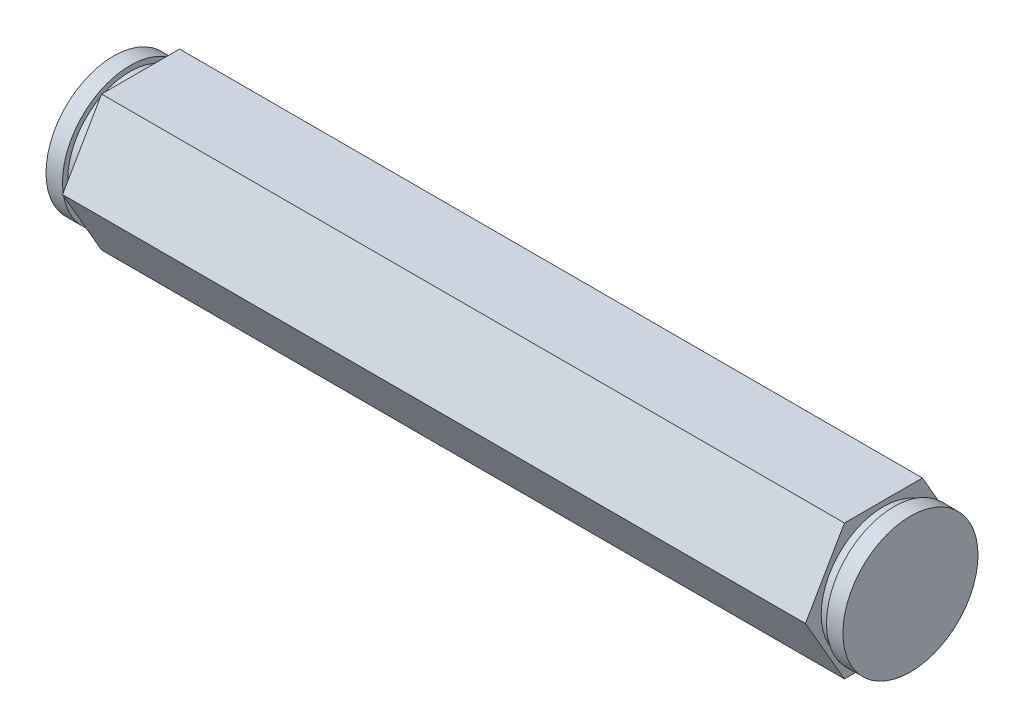
ISO-10303-21;
HEADER;
FILE_DESCRIPTION(('STEP AP214'),'2;1');
FILE_NAME('part.step','',(''),(''),'','','');
FILE_SCHEMA(('AUTOMOTIVE_DESIGN { 1 0 10303 214 1 1 1 1 }'));
ENDSEC;
DATA;
#1=APPLICATION_CONTEXT('core data for automotive mechanical design processes');
#2=APPLICATION_PROTOCOL_DEFINITION('international standard','automotive_design',2000,#1);
#3=PRODUCT_CONTEXT('',#1,'mechanical');
#4=PRODUCT('Part','Part','',(#3));
#5=PRODUCT_RELATED_PRODUCT_CATEGORY('part','',(#4));
#6=PRODUCT_DEFINITION_FORMATION('','',#4);
#7=PRODUCT_DEFINITION_CONTEXT('part definition',#1,'design');
#8=PRODUCT_DEFINITION('design','',#6,#7);
#9=PRODUCT_DEFINITION_SHAPE('','',#8);
#10=(LENGTH_UNIT() NAMED_UNIT(*) SI_UNIT(.MILLI.,.METRE.));
#11=(NAMED_UNIT(*) PLANE_ANGLE_UNIT() SI_UNIT($,.RADIAN.));
#12=(NAMED_UNIT(*) SI_UNIT($,.STERADIAN.) SOLID_ANGLE_UNIT());
#13=UNCERTAINTY_MEASURE_WITH_UNIT(LENGTH_MEASURE(1.E-05),#10,'distance_accuracy_value','');
#14=(GEOMETRIC_REPRESENTATION_CONTEXT(3) GLOBAL_UNCERTAINTY_ASSIGNED_CONTEXT((#13)) GLOBAL_UNIT_ASSIGNED_CONTEXT((#10,
#11,#12)) REPRESENTATION_CONTEXT('',''));
#15=CARTESIAN_POINT('',(0.,0.,0.));
#16=DIRECTION('',(0.,0.,1.));
#17=DIRECTION('',(1.,0.,0.));
#18=AXIS2_PLACEMENT_3D('',#15,#16,#17);
#19=CARTESIAN_POINT('',(37.465,-6.34999999999993,-3.66617420935418));
#20=DIRECTION('',(0.,0.499999999999995,0.866025403784441));
#21=DIRECTION('',(0.,-0.866025403784441,0.499999999999995));
#22=AXIS2_PLACEMENT_3D('',#19,#20,#21);
#23=PLANE('',#22);
#24=DIRECTION('',(-1.,0.,0.));
#25=VECTOR('',#24,1.);
#26=CARTESIAN_POINT('',(37.465,-6.34999999999993,-3.66617420935418));
#27=LINE('',#26,#25);
#28=CARTESIAN_POINT('',(34.925,-6.34999999999993,-3.66617420935418));
#29=VERTEX_POINT('',#28);
#30=CARTESIAN_POINT('',(-34.925,-6.34999999999993,-3.66617420935418));
#31=VERTEX_POINT('',#30);
#32=EDGE_CURVE('E105',#29,#31,#27,.T.);
#33=ORIENTED_EDGE('',*,*,#32,.T.);
#34=DIRECTION('',(0.,0.866025403784441,-0.499999999999995));
#35=VECTOR('',#34,1.);
#36=CARTESIAN_POINT('',(-34.925,-6.34999999999993,-3.66617420935418));
#37=LINE('',#36,#35);
#38=CARTESIAN_POINT('',(-34.925,0.,-7.33234841870821));
#39=VERTEX_POINT('',#38);
#40=EDGE_CURVE('E51',#31,#39,#37,.T.);
#41=ORIENTED_EDGE('',*,*,#40,.T.);
#42=DIRECTION('',(-1.,0.,0.));
#43=VECTOR('',#42,1.);
#44=CARTESIAN_POINT('',(37.465,0.,-7.33234841870821));
#45=LINE('',#44,#43);
#46=CARTESIAN_POINT('',(34.925,0.,-7.33234841870821));
#47=VERTEX_POINT('',#46);
#48=EDGE_CURVE('E118',#47,#39,#45,.T.);
#49=ORIENTED_EDGE('',*,*,#48,.F.);
#50=DIRECTION('',(0.,-0.866025403784441,0.499999999999995));
#51=VECTOR('',#50,1.);
#52=CARTESIAN_POINT('',(34.925,-6.34999999999993,-3.66617420935418));
#53=LINE('',#52,#51);
#54=EDGE_CURVE('E109',#47,#29,#53,.T.);
#55=ORIENTED_EDGE('',*,*,#54,.T.);
#56=EDGE_LOOP('',(#33,#41,#49,#55));
#57=FACE_BOUND('',#56,.T.);
#58=ADVANCED_FACE('F37',(#57),#23,.F.);
#59=CARTESIAN_POINT('',(37.465,0.,-7.33234841870821));
#60=DIRECTION('',(0.,-0.500000000000001,0.866025403784438));
#61=DIRECTION('',(0.,-0.866025403784438,-0.500000000000001));
#62=AXIS2_PLACEMENT_3D('',#59,#60,#61);
#63=PLANE('',#62);
#64=ORIENTED_EDGE('',*,*,#48,.T.);
#65=DIRECTION('',(0.,0.866025403784438,0.500000000000001));
#66=VECTOR('',#65,1.);
#67=CARTESIAN_POINT('',(-34.925,0.,-7.33234841870821));
#68=LINE('',#67,#66);
#69=CARTESIAN_POINT('',(-34.925,6.34999999999998,-3.66617420935409));
#70=VERTEX_POINT('',#69);
#71=EDGE_CURVE('E149',#39,#70,#68,.T.);
#72=ORIENTED_EDGE('',*,*,#71,.T.);
#73=DIRECTION('',(-1.,0.,0.));
#74=VECTOR('',#73,1.);
#75=CARTESIAN_POINT('',(37.465,6.34999999999998,-3.66617420935409));
#76=LINE('',#75,#74);
#77=CARTESIAN_POINT('',(34.925,6.34999999999998,-3.66617420935409));
#78=VERTEX_POINT('',#77);
#79=EDGE_CURVE('E115',#78,#70,#76,.T.);
#80=ORIENTED_EDGE('',*,*,#79,.F.);
#81=DIRECTION('',(0.,-0.866025403784438,-0.500000000000001));
#82=VECTOR('',#81,1.);
#83=CARTESIAN_POINT('',(34.925,0.,-7.33234841870821));
#84=LINE('',#83,#82);
#85=EDGE_CURVE('E169',#78,#47,#84,.T.);
#86=ORIENTED_EDGE('',*,*,#85,.T.);
#87=EDGE_LOOP('',(#64,#72,#80,#86));
#88=FACE_BOUND('',#87,.T.);
#89=ADVANCED_FACE('F177',(#88),#63,.F.);
#90=CARTESIAN_POINT('',(37.465,6.34999999999998,-3.66617420935409));
#91=DIRECTION('',(0.,-1.,0.));
#92=DIRECTION('',(0.,0.,-1.));
#93=AXIS2_PLACEMENT_3D('',#90,#91,#92);
#94=PLANE('',#93);
#95=ORIENTED_EDGE('',*,*,#79,.T.);
#96=DIRECTION('',(0.,0.,1.));
#97=VECTOR('',#96,1.);
#98=CARTESIAN_POINT('',(-34.925,6.34999999999998,-3.66617420935409));
#99=LINE('',#98,#97);
#100=CARTESIAN_POINT('',(-34.925,6.34999999999995,3.66617420935414));
#101=VERTEX_POINT('',#100);
#102=EDGE_CURVE('E146',#70,#101,#99,.T.);
#103=ORIENTED_EDGE('',*,*,#102,.T.);
#104=DIRECTION('',(-1.,0.,0.));
#105=VECTOR('',#104,1.);
#106=CARTESIAN_POINT('',(37.465,6.34999999999995,3.66617420935414));
#107=LINE('',#106,#105);
#108=CARTESIAN_POINT('',(34.925,6.34999999999995,3.66617420935414));
#109=VERTEX_POINT('',#108);
#110=EDGE_CURVE('E107',#109,#101,#107,.T.);
#111=ORIENTED_EDGE('',*,*,#110,.F.);
#112=DIRECTION('',(0.,0.,-1.));
#113=VECTOR('',#112,1.);
#114=CARTESIAN_POINT('',(34.925,6.34999999999998,-3.66617420935409));
#115=LINE('',#114,#113);
#116=EDGE_CURVE('E166',#109,#78,#115,.T.);
#117=ORIENTED_EDGE('',*,*,#116,.T.);
#118=EDGE_LOOP('',(#95,#103,#111,#117));
#119=FACE_BOUND('',#118,.T.);
#120=ADVANCED_FACE('F179',(#119),#94,.F.);
#121=CARTESIAN_POINT('',(37.465,6.34999999999995,3.66617420935414));
#122=DIRECTION('',(0.,-0.499999999999995,-0.866025403784442));
#123=DIRECTION('',(0.,0.866025403784442,-0.499999999999995));
#124=AXIS2_PLACEMENT_3D('',#121,#122,#123);
#125=PLANE('',#124);
#126=ORIENTED_EDGE('',*,*,#110,.T.);
#127=DIRECTION('',(0.,-0.866025403784442,0.499999999999995));
#128=VECTOR('',#127,1.);
#129=CARTESIAN_POINT('',(-34.925,6.34999999999995,3.66617420935414));
#130=LINE('',#129,#128);
#131=CARTESIAN_POINT('',(-34.925,0.,7.33234841870821));
#132=VERTEX_POINT('',#131);
#133=EDGE_CURVE('E100',#101,#132,#130,.T.);
#134=ORIENTED_EDGE('',*,*,#133,.T.);
#135=DIRECTION('',(-1.,0.,0.));
#136=VECTOR('',#135,1.);
#137=CARTESIAN_POINT('',(37.465,0.,7.33234841870821));
#138=LINE('',#137,#136);
#139=CARTESIAN_POINT('',(34.925,0.,7.33234841870821));
#140=VERTEX_POINT('',#139);
#141=EDGE_CURVE('E99',#140,#132,#138,.T.);
#142=ORIENTED_EDGE('',*,*,#141,.F.);
#143=DIRECTION('',(0.,0.866025403784442,-0.499999999999995));
#144=VECTOR('',#143,1.);
#145=CARTESIAN_POINT('',(34.925,6.34999999999995,3.66617420935414));
#146=LINE('',#145,#144);
#147=EDGE_CURVE('E163',#140,#109,#146,.T.);
#148=ORIENTED_EDGE('',*,*,#147,.T.);
#149=EDGE_LOOP('',(#126,#134,#142,#148));
#150=FACE_BOUND('',#149,.T.);
#151=ADVANCED_FACE('F182',(#150),#125,.F.);
#152=CARTESIAN_POINT('',(37.465,0.,7.33234841870821));
#153=DIRECTION('',(0.,0.500000000000007,-0.866025403784435));
#154=DIRECTION('',(0.,0.866025403784435,0.500000000000007));
#155=AXIS2_PLACEMENT_3D('',#152,#153,#154);
#156=PLANE('',#155);
#157=ORIENTED_EDGE('',*,*,#141,.T.);
#158=DIRECTION('',(0.,-0.866025403784435,-0.500000000000007));
#159=VECTOR('',#158,1.);
#160=CARTESIAN_POINT('',(-34.925,0.,7.33234841870821));
#161=LINE('',#160,#159);
#162=CARTESIAN_POINT('',(-34.925,-6.35,3.66617420935405));
#163=VERTEX_POINT('',#162);
#164=EDGE_CURVE('E87',#132,#163,#161,.T.);
#165=ORIENTED_EDGE('',*,*,#164,.T.);
#166=DIRECTION('',(-1.,0.,0.));
#167=VECTOR('',#166,1.);
#168=CARTESIAN_POINT('',(37.465,-6.35,3.66617420935405));
#169=LINE('',#168,#167);
#170=CARTESIAN_POINT('',(34.925,-6.35,3.66617420935405));
#171=VERTEX_POINT('',#170);
#172=EDGE_CURVE('E97',#171,#163,#169,.T.);
#173=ORIENTED_EDGE('',*,*,#172,.F.);
#174=DIRECTION('',(0.,0.866025403784435,0.500000000000007));
#175=VECTOR('',#174,1.);
#176=CARTESIAN_POINT('',(34.925,0.,7.33234841870821));
#177=LINE('',#176,#175);
#178=EDGE_CURVE('E58',#171,#140,#177,.T.);
#179=ORIENTED_EDGE('',*,*,#178,.T.);
#180=EDGE_LOOP('',(#157,#165,#173,#179));
#181=FACE_BOUND('',#180,.T.);
#182=ADVANCED_FACE('F96',(#181),#156,.F.);
#183=CARTESIAN_POINT('',(37.465,-6.35,3.66617420935405));
#184=DIRECTION('',(0.,1.,0.));
#185=DIRECTION('',(0.,0.,1.));
#186=AXIS2_PLACEMENT_3D('',#183,#184,#185);
#187=PLANE('',#186);
#188=ORIENTED_EDGE('',*,*,#172,.T.);
#189=DIRECTION('',(0.,0.,-1.));
#190=VECTOR('',#189,1.);
#191=CARTESIAN_POINT('',(-34.925,-6.35,3.66617420935405));
#192=LINE('',#191,#190);
#193=EDGE_CURVE('E11',#163,#31,#192,.T.);
#194=ORIENTED_EDGE('',*,*,#193,.T.);
#195=ORIENTED_EDGE('',*,*,#32,.F.);
#196=DIRECTION('',(0.,0.,1.));
#197=VECTOR('',#196,1.);
#198=CARTESIAN_POINT('',(34.925,-6.35,3.66617420935405));
#199=LINE('',#198,#197);
#200=EDGE_CURVE('E104',#29,#171,#199,.T.);
#201=ORIENTED_EDGE('',*,*,#200,.T.);
#202=EDGE_LOOP('',(#188,#194,#195,#201));
#203=FACE_BOUND('',#202,.T.);
#204=ADVANCED_FACE('F103',(#203),#187,.F.);
#205=CARTESIAN_POINT('',(34.925,0.,8.89));
#206=DIRECTION('',(-1.,0.,0.));
#207=DIRECTION('',(0.,0.,1.));
#208=AXIS2_PLACEMENT_3D('',#205,#206,#207);
#209=PLANE('',#208);
#210=CARTESIAN_POINT('',(34.925,0.,0.));
#211=DIRECTION('',(-1.,0.,0.));
#212=DIRECTION('',(0.,0.,1.));
#213=AXIS2_PLACEMENT_3D('',#210,#211,#212);
#214=CIRCLE('',#213,5.8547);
#215=CARTESIAN_POINT('',(34.925,0.,5.8547));
#216=VERTEX_POINT('',#215);
#217=EDGE_CURVE('E159',#216,#216,#214,.T.);
#218=ORIENTED_EDGE('',*,*,#217,.T.);
#219=EDGE_LOOP('',(#218));
#220=FACE_BOUND('',#219,.T.);
#221=ORIENTED_EDGE('',*,*,#85,.F.);
#222=ORIENTED_EDGE('',*,*,#116,.F.);
#223=ORIENTED_EDGE('',*,*,#147,.F.);
#224=ORIENTED_EDGE('',*,*,#178,.F.);
#225=ORIENTED_EDGE('',*,*,#200,.F.);
#226=ORIENTED_EDGE('',*,*,#54,.F.);
#227=EDGE_LOOP('',(#221,#222,#223,#224,#225,#226));
#228=FACE_BOUND('',#227,.T.);
#229=ADVANCED_FACE('F174',(#220,#228),#209,.F.);
#230=CARTESIAN_POINT('',(0.,0.,0.));
#231=DIRECTION('',(-1.,0.,0.));
#232=DIRECTION('',(0.,0.,1.));
#233=AXIS2_PLACEMENT_3D('',#230,#231,#232);
#234=CYLINDRICAL_SURFACE('',#233,6.35);
#235=CARTESIAN_POINT('',(37.465,0.,0.));
#236=DIRECTION('',(1.,0.,0.));
#237=DIRECTION('',(0.,0.,-1.));
#238=AXIS2_PLACEMENT_3D('',#235,#236,#237);
#239=CIRCLE('',#238,6.35);
#240=CARTESIAN_POINT('',(37.465,0.,-6.35));
#241=VERTEX_POINT('',#240);
#242=EDGE_CURVE('E121',#241,#241,#239,.F.);
#243=ORIENTED_EDGE('',*,*,#242,.T.);
#244=EDGE_LOOP('',(#243));
#245=FACE_BOUND('',#244,.T.);
#246=CARTESIAN_POINT('',(35.9156,0.,0.));
#247=DIRECTION('',(-1.,0.,0.));
#248=DIRECTION('',(0.,0.,1.));
#249=AXIS2_PLACEMENT_3D('',#246,#247,#248);
#250=CIRCLE('',#249,6.35);
#251=CARTESIAN_POINT('',(35.9156,0.,6.35));
#252=VERTEX_POINT('',#251);
#253=EDGE_CURVE('E153',#252,#252,#250,.T.);
#254=ORIENTED_EDGE('',*,*,#253,.F.);
#255=EDGE_LOOP('',(#254));
#256=FACE_BOUND('',#255,.T.);
#257=ADVANCED_FACE('F299',(#245,#256),#234,.T.);
#258=CARTESIAN_POINT('',(0.,0.,0.));
#259=DIRECTION('',(-1.,0.,0.));
#260=DIRECTION('',(0.,0.,1.));
#261=AXIS2_PLACEMENT_3D('',#258,#259,#260);
#262=CYLINDRICAL_SURFACE('',#261,5.8547);
#263=ORIENTED_EDGE('',*,*,#217,.F.);
#264=EDGE_LOOP('',(#263));
#265=FACE_BOUND('',#264,.T.);
#266=CARTESIAN_POINT('',(35.9156,0.,0.));
#267=DIRECTION('',(-1.,0.,0.));
#268=DIRECTION('',(0.,0.,1.));
#269=AXIS2_PLACEMENT_3D('',#266,#267,#268);
#270=CIRCLE('',#269,5.8547);
#271=CARTESIAN_POINT('',(35.9156,0.,5.8547));
#272=VERTEX_POINT('',#271);
#273=EDGE_CURVE('E156',#272,#272,#270,.T.);
#274=ORIENTED_EDGE('',*,*,#273,.T.);
#275=EDGE_LOOP('',(#274));
#276=FACE_BOUND('',#275,.T.);
#277=ADVANCED_FACE('F287',(#265,#276),#262,.T.);
#278=CARTESIAN_POINT('',(35.9156,0.,5.8547));
#279=DIRECTION('',(1.,0.,0.));
#280=DIRECTION('',(0.,0.,-1.));
#281=AXIS2_PLACEMENT_3D('',#278,#279,#280);
#282=PLANE('',#281);
#283=ORIENTED_EDGE('',*,*,#273,.F.);
#284=EDGE_LOOP('',(#283));
#285=FACE_BOUND('',#284,.T.);
#286=ORIENTED_EDGE('',*,*,#253,.T.);
#287=EDGE_LOOP('',(#286));
#288=FACE_BOUND('',#287,.T.);
#289=ADVANCED_FACE('F281',(#285,#288),#282,.F.);
#290=CARTESIAN_POINT('',(37.465,0.,0.));
#291=DIRECTION('',(1.,0.,0.));
#292=DIRECTION('',(0.,0.,-1.));
#293=AXIS2_PLACEMENT_3D('',#290,#291,#292);
#294=PLANE('',#293);
#295=ORIENTED_EDGE('',*,*,#242,.F.);
#296=EDGE_LOOP('',(#295));
#297=FACE_BOUND('',#296,.T.);
#298=ADVANCED_FACE('F234',(#297),#294,.T.);
#299=CARTESIAN_POINT('',(-34.925,0.,8.89));
#300=DIRECTION('',(1.,0.,0.));
#301=DIRECTION('',(0.,0.,1.));
#302=AXIS2_PLACEMENT_3D('',#299,#300,#301);
#303=PLANE('',#302);
#304=CARTESIAN_POINT('',(-34.925,0.,0.));
#305=DIRECTION('',(-1.,0.,0.));
#306=DIRECTION('',(0.,0.,1.));
#307=AXIS2_PLACEMENT_3D('',#304,#305,#306);
#308=CIRCLE('',#307,5.8547);
#309=CARTESIAN_POINT('',(-34.925,0.,5.8547));
#310=VERTEX_POINT('',#309);
#311=EDGE_CURVE('E101',#310,#310,#308,.T.);
#312=ORIENTED_EDGE('',*,*,#311,.F.);
#313=EDGE_LOOP('',(#312));
#314=FACE_BOUND('',#313,.T.);
#315=ORIENTED_EDGE('',*,*,#193,.F.);
#316=ORIENTED_EDGE('',*,*,#164,.F.);
#317=ORIENTED_EDGE('',*,*,#133,.F.);
#318=ORIENTED_EDGE('',*,*,#102,.F.);
#319=ORIENTED_EDGE('',*,*,#71,.F.);
#320=ORIENTED_EDGE('',*,*,#40,.F.);
#321=EDGE_LOOP('',(#315,#316,#317,#318,#319,#320));
#322=FACE_BOUND('',#321,.T.);
#323=ADVANCED_FACE('F86',(#314,#322),#303,.F.);
#324=CARTESIAN_POINT('',(0.,0.,0.));
#325=DIRECTION('',(1.,0.,0.));
#326=DIRECTION('',(0.,0.,1.));
#327=AXIS2_PLACEMENT_3D('',#324,#325,#326);
#328=CYLINDRICAL_SURFACE('',#327,6.35);
#329=CARTESIAN_POINT('',(-37.465,0.,0.));
#330=DIRECTION('',(1.,0.,0.));
#331=DIRECTION('',(0.,0.,-1.));
#332=AXIS2_PLACEMENT_3D('',#329,#330,#331);
#333=CIRCLE('',#332,6.35);
#334=CARTESIAN_POINT('',(-37.465,0.,-6.35));
#335=VERTEX_POINT('',#334);
#336=EDGE_CURVE('E44',#335,#335,#333,.F.);
#337=ORIENTED_EDGE('',*,*,#336,.F.);
#338=EDGE_LOOP('',(#337));
#339=FACE_BOUND('',#338,.T.);
#340=CARTESIAN_POINT('',(-35.9156,0.,0.));
#341=DIRECTION('',(-1.,0.,0.));
#342=DIRECTION('',(0.,0.,1.));
#343=AXIS2_PLACEMENT_3D('',#340,#341,#342);
#344=CIRCLE('',#343,6.35);
#345=CARTESIAN_POINT('',(-35.9156,0.,6.35));
#346=VERTEX_POINT('',#345);
#347=EDGE_CURVE('E136',#346,#346,#344,.T.);
#348=ORIENTED_EDGE('',*,*,#347,.T.);
#349=EDGE_LOOP('',(#348));
#350=FACE_BOUND('',#349,.T.);
#351=ADVANCED_FACE('F129',(#339,#350),#328,.T.);
#352=CARTESIAN_POINT('',(0.,0.,0.));
#353=DIRECTION('',(1.,0.,0.));
#354=DIRECTION('',(0.,0.,1.));
#355=AXIS2_PLACEMENT_3D('',#352,#353,#354);
#356=CYLINDRICAL_SURFACE('',#355,5.8547);
#357=ORIENTED_EDGE('',*,*,#311,.T.);
#358=EDGE_LOOP('',(#357));
#359=FACE_BOUND('',#358,.T.);
#360=CARTESIAN_POINT('',(-35.9156,0.,0.));
#361=DIRECTION('',(-1.,0.,0.));
#362=DIRECTION('',(0.,0.,1.));
#363=AXIS2_PLACEMENT_3D('',#360,#361,#362);
#364=CIRCLE('',#363,5.8547);
#365=CARTESIAN_POINT('',(-35.9156,0.,5.8547));
#366=VERTEX_POINT('',#365);
#367=EDGE_CURVE('E138',#366,#366,#364,.T.);
#368=ORIENTED_EDGE('',*,*,#367,.F.);
#369=EDGE_LOOP('',(#368));
#370=FACE_BOUND('',#369,.T.);
#371=ADVANCED_FACE('F132',(#359,#370),#356,.T.);
#372=CARTESIAN_POINT('',(-35.9156,0.,5.8547));
#373=DIRECTION('',(-1.,0.,0.));
#374=DIRECTION('',(0.,0.,-1.));
#375=AXIS2_PLACEMENT_3D('',#372,#373,#374);
#376=PLANE('',#375);
#377=ORIENTED_EDGE('',*,*,#367,.T.);
#378=EDGE_LOOP('',(#377));
#379=FACE_BOUND('',#378,.T.);
#380=ORIENTED_EDGE('',*,*,#347,.F.);
#381=EDGE_LOOP('',(#380));
#382=FACE_BOUND('',#381,.T.);
#383=ADVANCED_FACE('F254',(#379,#382),#376,.F.);
#384=CARTESIAN_POINT('',(-37.465,0.,0.));
#385=DIRECTION('',(1.,0.,0.));
#386=DIRECTION('',(0.,0.,-1.));
#387=AXIS2_PLACEMENT_3D('',#384,#385,#386);
#388=PLANE('',#387);
#389=ORIENTED_EDGE('',*,*,#336,.T.);
#390=EDGE_LOOP('',(#389));
#391=FACE_BOUND('',#390,.T.);
#392=ADVANCED_FACE('F127',(#391),#388,.F.);
#393=CLOSED_SHELL('',(#58,#89,#120,#151,#182,#204,#229,#257,#277,#289,#298,#323,#351,#371,#383,#392));
#394=MANIFOLD_SOLID_BREP('B2',#393);
#395=ADVANCED_BREP_SHAPE_REPRESENTATION('',(#18,#394),#14);
#396=SHAPE_DEFINITION_REPRESENTATION(#9,#395);
ENDSEC;
END-ISO-10303-21;
